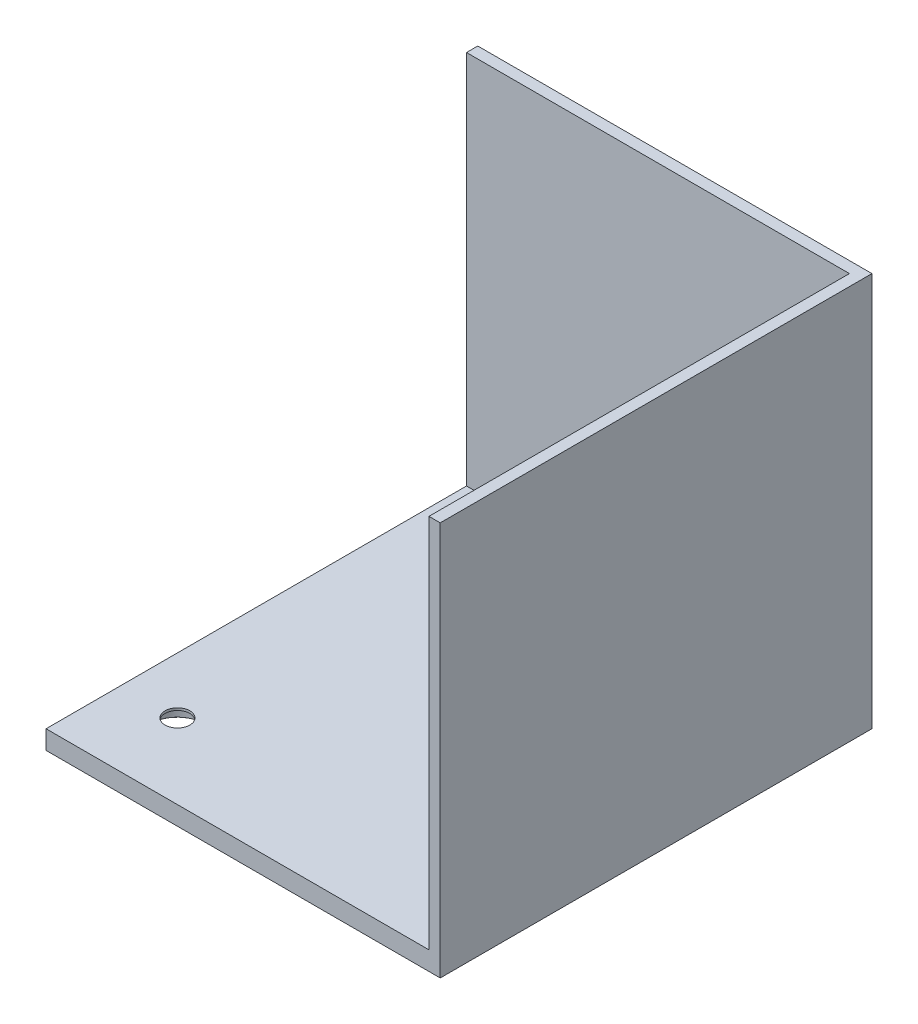
ISO-10303-21;
HEADER;
FILE_DESCRIPTION(('STEP AP214'),'2;1');
FILE_NAME('part.step','',(''),(''),'','','');
FILE_SCHEMA(('AUTOMOTIVE_DESIGN { 1 0 10303 214 1 1 1 1 }'));
ENDSEC;
DATA;
#1=APPLICATION_CONTEXT('core data for automotive mechanical design processes');
#2=APPLICATION_PROTOCOL_DEFINITION('international standard','automotive_design',2000,#1);
#3=PRODUCT_CONTEXT('',#1,'mechanical');
#4=PRODUCT('Part','Part','',(#3));
#5=PRODUCT_RELATED_PRODUCT_CATEGORY('part','',(#4));
#6=PRODUCT_DEFINITION_FORMATION('','',#4);
#7=PRODUCT_DEFINITION_CONTEXT('part definition',#1,'design');
#8=PRODUCT_DEFINITION('design','',#6,#7);
#9=PRODUCT_DEFINITION_SHAPE('','',#8);
#10=(LENGTH_UNIT() NAMED_UNIT(*) SI_UNIT(.MILLI.,.METRE.));
#11=(NAMED_UNIT(*) PLANE_ANGLE_UNIT() SI_UNIT($,.RADIAN.));
#12=(NAMED_UNIT(*) SI_UNIT($,.STERADIAN.) SOLID_ANGLE_UNIT());
#13=UNCERTAINTY_MEASURE_WITH_UNIT(LENGTH_MEASURE(1.E-05),#10,'distance_accuracy_value','');
#14=(GEOMETRIC_REPRESENTATION_CONTEXT(3) GLOBAL_UNCERTAINTY_ASSIGNED_CONTEXT((#13)) GLOBAL_UNIT_ASSIGNED_CONTEXT((#10,
#11,#12)) REPRESENTATION_CONTEXT('',''));
#15=CARTESIAN_POINT('',(0.,0.,0.));
#16=DIRECTION('',(0.,0.,1.));
#17=DIRECTION('',(1.,0.,0.));
#18=AXIS2_PLACEMENT_3D('',#15,#16,#17);
#19=CARTESIAN_POINT('',(52.5,105.,57.5));
#20=DIRECTION('',(-1.,0.,0.));
#21=DIRECTION('',(0.,0.,1.));
#22=AXIS2_PLACEMENT_3D('',#19,#20,#21);
#23=PLANE('',#22);
#24=DIRECTION('',(0.,0.,-1.));
#25=VECTOR('',#24,1.);
#26=CARTESIAN_POINT('',(52.5,0.,57.5));
#27=LINE('',#26,#25);
#28=CARTESIAN_POINT('',(52.5,0.,57.5));
#29=VERTEX_POINT('',#28);
#30=CARTESIAN_POINT('',(52.5,0.,-57.5));
#31=VERTEX_POINT('',#30);
#32=EDGE_CURVE('E137',#29,#31,#27,.T.);
#33=ORIENTED_EDGE('',*,*,#32,.T.);
#34=DIRECTION('',(0.,-1.,0.));
#35=VECTOR('',#34,1.);
#36=CARTESIAN_POINT('',(52.5,105.,-57.5));
#37=LINE('',#36,#35);
#38=CARTESIAN_POINT('',(52.5,105.,-57.5));
#39=VERTEX_POINT('',#38);
#40=EDGE_CURVE('E11',#39,#31,#37,.T.);
#41=ORIENTED_EDGE('',*,*,#40,.F.);
#42=DIRECTION('',(0.,0.,-1.));
#43=VECTOR('',#42,1.);
#44=CARTESIAN_POINT('',(52.5,105.,57.5));
#45=LINE('',#44,#43);
#46=CARTESIAN_POINT('',(52.5,105.,57.5));
#47=VERTEX_POINT('',#46);
#48=EDGE_CURVE('E139',#47,#39,#45,.T.);
#49=ORIENTED_EDGE('',*,*,#48,.F.);
#50=DIRECTION('',(0.,-1.,0.));
#51=VECTOR('',#50,1.);
#52=CARTESIAN_POINT('',(52.5,105.,57.5));
#53=LINE('',#52,#51);
#54=EDGE_CURVE('E146',#47,#29,#53,.T.);
#55=ORIENTED_EDGE('',*,*,#54,.T.);
#56=EDGE_LOOP('',(#33,#41,#49,#55));
#57=FACE_BOUND('',#56,.T.);
#58=ADVANCED_FACE('F37',(#57),#23,.F.);
#59=CARTESIAN_POINT('',(-52.5,105.,-57.5));
#60=DIRECTION('',(0.,0.,1.));
#61=DIRECTION('',(1.,0.,0.));
#62=AXIS2_PLACEMENT_3D('',#59,#60,#61);
#63=PLANE('',#62);
#64=DIRECTION('',(-1.,0.,0.));
#65=VECTOR('',#64,1.);
#66=CARTESIAN_POINT('',(-52.5,0.,-57.5));
#67=LINE('',#66,#65);
#68=CARTESIAN_POINT('',(-52.5,0.,-57.5));
#69=VERTEX_POINT('',#68);
#70=EDGE_CURVE('E149',#31,#69,#67,.T.);
#71=ORIENTED_EDGE('',*,*,#70,.T.);
#72=DIRECTION('',(0.,-1.,0.));
#73=VECTOR('',#72,1.);
#74=CARTESIAN_POINT('',(-52.5,105.,-57.5));
#75=LINE('',#74,#73);
#76=CARTESIAN_POINT('',(-52.5,105.,-57.5));
#77=VERTEX_POINT('',#76);
#78=EDGE_CURVE('E45',#77,#69,#75,.T.);
#79=ORIENTED_EDGE('',*,*,#78,.F.);
#80=DIRECTION('',(-1.,0.,0.));
#81=VECTOR('',#80,1.);
#82=CARTESIAN_POINT('',(-52.5,105.,-57.5));
#83=LINE('',#82,#81);
#84=EDGE_CURVE('E86',#39,#77,#83,.T.);
#85=ORIENTED_EDGE('',*,*,#84,.F.);
#86=ORIENTED_EDGE('',*,*,#40,.T.);
#87=EDGE_LOOP('',(#71,#79,#85,#86));
#88=FACE_BOUND('',#87,.T.);
#89=ADVANCED_FACE('F219',(#88),#63,.F.);
#90=CARTESIAN_POINT('',(-52.5,105.,57.5));
#91=DIRECTION('',(1.,0.,0.));
#92=DIRECTION('',(0.,0.,-1.));
#93=AXIS2_PLACEMENT_3D('',#90,#91,#92);
#94=PLANE('',#93);
#95=DIRECTION('',(0.,0.,1.));
#96=VECTOR('',#95,1.);
#97=CARTESIAN_POINT('',(-52.5,4.99999999999999,-54.5));
#98=LINE('',#97,#96);
#99=CARTESIAN_POINT('',(-52.5,4.99999999999999,-54.5));
#100=VERTEX_POINT('',#99);
#101=CARTESIAN_POINT('',(-52.5,4.99999999999999,57.5));
#102=VERTEX_POINT('',#101);
#103=EDGE_CURVE('E119',#100,#102,#98,.T.);
#104=ORIENTED_EDGE('',*,*,#103,.F.);
#105=DIRECTION('',(0.,1.,0.));
#106=VECTOR('',#105,1.);
#107=CARTESIAN_POINT('',(-52.5,4.99999999999999,-54.5));
#108=LINE('',#107,#106);
#109=CARTESIAN_POINT('',(-52.5,105.,-54.5));
#110=VERTEX_POINT('',#109);
#111=EDGE_CURVE('E110',#100,#110,#108,.T.);
#112=ORIENTED_EDGE('',*,*,#111,.T.);
#113=DIRECTION('',(0.,0.,1.));
#114=VECTOR('',#113,1.);
#115=CARTESIAN_POINT('',(-52.5,105.,57.5));
#116=LINE('',#115,#114);
#117=EDGE_CURVE('E142',#77,#110,#116,.T.);
#118=ORIENTED_EDGE('',*,*,#117,.F.);
#119=ORIENTED_EDGE('',*,*,#78,.T.);
#120=DIRECTION('',(0.,0.,1.));
#121=VECTOR('',#120,1.);
#122=CARTESIAN_POINT('',(-52.5,0.,57.5));
#123=LINE('',#122,#121);
#124=CARTESIAN_POINT('',(-52.5,0.,57.5));
#125=VERTEX_POINT('',#124);
#126=EDGE_CURVE('E151',#69,#125,#123,.T.);
#127=ORIENTED_EDGE('',*,*,#126,.T.);
#128=DIRECTION('',(0.,-1.,0.));
#129=VECTOR('',#128,1.);
#130=CARTESIAN_POINT('',(-52.5,105.,57.5));
#131=LINE('',#130,#129);
#132=EDGE_CURVE('E156',#102,#125,#131,.T.);
#133=ORIENTED_EDGE('',*,*,#132,.F.);
#134=EDGE_LOOP('',(#104,#112,#118,#119,#127,#133));
#135=FACE_BOUND('',#134,.T.);
#136=ADVANCED_FACE('F224',(#135),#94,.F.);
#137=CARTESIAN_POINT('',(-52.5,105.,57.5));
#138=DIRECTION('',(0.,0.,-1.));
#139=DIRECTION('',(-1.,0.,0.));
#140=AXIS2_PLACEMENT_3D('',#137,#138,#139);
#141=PLANE('',#140);
#142=DIRECTION('',(1.,0.,0.));
#143=VECTOR('',#142,1.);
#144=CARTESIAN_POINT('',(-52.5,105.,57.5));
#145=LINE('',#144,#143);
#146=CARTESIAN_POINT('',(49.5,105.,57.5));
#147=VERTEX_POINT('',#146);
#148=EDGE_CURVE('E61',#147,#47,#145,.T.);
#149=ORIENTED_EDGE('',*,*,#148,.F.);
#150=DIRECTION('',(0.,1.,0.));
#151=VECTOR('',#150,1.);
#152=CARTESIAN_POINT('',(49.5,4.99999999999999,57.5));
#153=LINE('',#152,#151);
#154=CARTESIAN_POINT('',(49.5,4.99999999999999,57.5));
#155=VERTEX_POINT('',#154);
#156=EDGE_CURVE('E135',#155,#147,#153,.T.);
#157=ORIENTED_EDGE('',*,*,#156,.F.);
#158=DIRECTION('',(1.,0.,0.));
#159=VECTOR('',#158,1.);
#160=CARTESIAN_POINT('',(49.5,4.99999999999999,57.5));
#161=LINE('',#160,#159);
#162=EDGE_CURVE('E111',#102,#155,#161,.T.);
#163=ORIENTED_EDGE('',*,*,#162,.F.);
#164=ORIENTED_EDGE('',*,*,#132,.T.);
#165=DIRECTION('',(1.,0.,0.));
#166=VECTOR('',#165,1.);
#167=CARTESIAN_POINT('',(-52.5,0.,57.5));
#168=LINE('',#167,#166);
#169=EDGE_CURVE('E81',#125,#29,#168,.T.);
#170=ORIENTED_EDGE('',*,*,#169,.T.);
#171=ORIENTED_EDGE('',*,*,#54,.F.);
#172=EDGE_LOOP('',(#149,#157,#163,#164,#170,#171));
#173=FACE_BOUND('',#172,.T.);
#174=ADVANCED_FACE('F235',(#173),#141,.F.);
#175=CARTESIAN_POINT('',(0.,105.,0.));
#176=DIRECTION('',(0.,-1.,0.));
#177=DIRECTION('',(0.,0.,-1.));
#178=AXIS2_PLACEMENT_3D('',#175,#176,#177);
#179=PLANE('',#178);
#180=DIRECTION('',(-1.,0.,0.));
#181=VECTOR('',#180,1.);
#182=CARTESIAN_POINT('',(49.5,105.,-54.5));
#183=LINE('',#182,#181);
#184=CARTESIAN_POINT('',(49.5,105.,-54.5));
#185=VERTEX_POINT('',#184);
#186=EDGE_CURVE('E124',#185,#110,#183,.T.);
#187=ORIENTED_EDGE('',*,*,#186,.F.);
#188=DIRECTION('',(0.,0.,-1.));
#189=VECTOR('',#188,1.);
#190=CARTESIAN_POINT('',(49.5,105.,-54.5));
#191=LINE('',#190,#189);
#192=EDGE_CURVE('E53',#147,#185,#191,.T.);
#193=ORIENTED_EDGE('',*,*,#192,.F.);
#194=ORIENTED_EDGE('',*,*,#148,.T.);
#195=ORIENTED_EDGE('',*,*,#48,.T.);
#196=ORIENTED_EDGE('',*,*,#84,.T.);
#197=ORIENTED_EDGE('',*,*,#117,.T.);
#198=EDGE_LOOP('',(#187,#193,#194,#195,#196,#197));
#199=FACE_BOUND('',#198,.T.);
#200=ADVANCED_FACE('F234',(#199),#179,.F.);
#201=CARTESIAN_POINT('',(0.,0.,0.));
#202=DIRECTION('',(0.,-1.,0.));
#203=DIRECTION('',(0.,0.,-1.));
#204=AXIS2_PLACEMENT_3D('',#201,#202,#203);
#205=PLANE('',#204);
#206=CARTESIAN_POINT('',(37.5,0.,37.5));
#207=DIRECTION('',(0.,-1.,0.));
#208=DIRECTION('',(0.,0.,-1.));
#209=AXIS2_PLACEMENT_3D('',#206,#207,#208);
#210=CIRCLE('',#209,7.3);
#211=CARTESIAN_POINT('',(37.5,0.,30.2));
#212=VERTEX_POINT('',#211);
#213=EDGE_CURVE('E323',#212,#212,#210,.T.);
#214=ORIENTED_EDGE('',*,*,#213,.F.);
#215=EDGE_LOOP('',(#214));
#216=FACE_BOUND('',#215,.T.);
#217=CARTESIAN_POINT('',(37.5,0.,-37.5));
#218=DIRECTION('',(0.,-1.,0.));
#219=DIRECTION('',(0.,0.,-1.));
#220=AXIS2_PLACEMENT_3D('',#217,#218,#219);
#221=CIRCLE('',#220,7.3);
#222=CARTESIAN_POINT('',(37.5,0.,-44.8));
#223=VERTEX_POINT('',#222);
#224=EDGE_CURVE('E333',#223,#223,#221,.T.);
#225=ORIENTED_EDGE('',*,*,#224,.F.);
#226=EDGE_LOOP('',(#225));
#227=FACE_BOUND('',#226,.T.);
#228=CARTESIAN_POINT('',(-37.5,0.,-37.5));
#229=DIRECTION('',(0.,-1.,0.));
#230=DIRECTION('',(0.,0.,-1.));
#231=AXIS2_PLACEMENT_3D('',#228,#229,#230);
#232=CIRCLE('',#231,7.3);
#233=CARTESIAN_POINT('',(-37.5,0.,-44.8));
#234=VERTEX_POINT('',#233);
#235=EDGE_CURVE('E168',#234,#234,#232,.T.);
#236=ORIENTED_EDGE('',*,*,#235,.F.);
#237=EDGE_LOOP('',(#236));
#238=FACE_BOUND('',#237,.T.);
#239=CARTESIAN_POINT('',(-37.5,0.,37.5));
#240=DIRECTION('',(0.,-1.,0.));
#241=DIRECTION('',(0.,0.,-1.));
#242=AXIS2_PLACEMENT_3D('',#239,#240,#241);
#243=CIRCLE('',#242,7.3);
#244=CARTESIAN_POINT('',(-37.5,0.,30.2));
#245=VERTEX_POINT('',#244);
#246=EDGE_CURVE('E164',#245,#245,#243,.T.);
#247=ORIENTED_EDGE('',*,*,#246,.F.);
#248=EDGE_LOOP('',(#247));
#249=FACE_BOUND('',#248,.T.);
#250=ORIENTED_EDGE('',*,*,#32,.F.);
#251=ORIENTED_EDGE('',*,*,#169,.F.);
#252=ORIENTED_EDGE('',*,*,#126,.F.);
#253=ORIENTED_EDGE('',*,*,#70,.F.);
#254=EDGE_LOOP('',(#250,#251,#252,#253));
#255=FACE_BOUND('',#254,.T.);
#256=ADVANCED_FACE('F229',(#216,#227,#238,#249,#255),#205,.T.);
#257=CARTESIAN_POINT('',(49.5,4.99999999999999,-54.5));
#258=DIRECTION('',(1.,0.,0.));
#259=DIRECTION('',(0.,0.,-1.));
#260=AXIS2_PLACEMENT_3D('',#257,#258,#259);
#261=PLANE('',#260);
#262=ORIENTED_EDGE('',*,*,#192,.T.);
#263=DIRECTION('',(0.,1.,0.));
#264=VECTOR('',#263,1.);
#265=CARTESIAN_POINT('',(49.5,4.99999999999999,-54.5));
#266=LINE('',#265,#264);
#267=CARTESIAN_POINT('',(49.5,4.99999999999999,-54.5));
#268=VERTEX_POINT('',#267);
#269=EDGE_CURVE('E102',#268,#185,#266,.T.);
#270=ORIENTED_EDGE('',*,*,#269,.F.);
#271=DIRECTION('',(0.,0.,-1.));
#272=VECTOR('',#271,1.);
#273=CARTESIAN_POINT('',(49.5,4.99999999999999,-54.5));
#274=LINE('',#273,#272);
#275=EDGE_CURVE('E106',#155,#268,#274,.T.);
#276=ORIENTED_EDGE('',*,*,#275,.F.);
#277=ORIENTED_EDGE('',*,*,#156,.T.);
#278=EDGE_LOOP('',(#262,#270,#276,#277));
#279=FACE_BOUND('',#278,.T.);
#280=ADVANCED_FACE('F104',(#279),#261,.F.);
#281=CARTESIAN_POINT('',(49.5,4.99999999999999,-54.5));
#282=DIRECTION('',(0.,0.,-1.));
#283=DIRECTION('',(-1.,0.,0.));
#284=AXIS2_PLACEMENT_3D('',#281,#282,#283);
#285=PLANE('',#284);
#286=ORIENTED_EDGE('',*,*,#186,.T.);
#287=ORIENTED_EDGE('',*,*,#111,.F.);
#288=DIRECTION('',(-1.,0.,0.));
#289=VECTOR('',#288,1.);
#290=CARTESIAN_POINT('',(49.5,4.99999999999999,-54.5));
#291=LINE('',#290,#289);
#292=EDGE_CURVE('E114',#268,#100,#291,.T.);
#293=ORIENTED_EDGE('',*,*,#292,.F.);
#294=ORIENTED_EDGE('',*,*,#269,.T.);
#295=EDGE_LOOP('',(#286,#287,#293,#294));
#296=FACE_BOUND('',#295,.T.);
#297=ADVANCED_FACE('F115',(#296),#285,.F.);
#298=CARTESIAN_POINT('',(0.,4.99999999999999,0.));
#299=DIRECTION('',(0.,-1.,0.));
#300=DIRECTION('',(0.,0.,-1.));
#301=AXIS2_PLACEMENT_3D('',#298,#299,#300);
#302=PLANE('',#301);
#303=CARTESIAN_POINT('',(37.5,4.99999999999999,37.5));
#304=DIRECTION('',(0.,-1.,0.));
#305=DIRECTION('',(0.,0.,-1.));
#306=AXIS2_PLACEMENT_3D('',#303,#304,#305);
#307=CIRCLE('',#306,3.29999999999999);
#308=CARTESIAN_POINT('',(37.5,4.99999999999999,34.2));
#309=VERTEX_POINT('',#308);
#310=EDGE_CURVE('E40',#309,#309,#307,.T.);
#311=ORIENTED_EDGE('',*,*,#310,.T.);
#312=EDGE_LOOP('',(#311));
#313=FACE_BOUND('',#312,.T.);
#314=CARTESIAN_POINT('',(37.5,4.99999999999999,-37.5));
#315=DIRECTION('',(0.,-1.,0.));
#316=DIRECTION('',(0.,0.,-1.));
#317=AXIS2_PLACEMENT_3D('',#314,#315,#316);
#318=CIRCLE('',#317,3.29999999999999);
#319=CARTESIAN_POINT('',(37.5,4.99999999999999,-40.8));
#320=VERTEX_POINT('',#319);
#321=EDGE_CURVE('E166',#320,#320,#318,.T.);
#322=ORIENTED_EDGE('',*,*,#321,.T.);
#323=EDGE_LOOP('',(#322));
#324=FACE_BOUND('',#323,.T.);
#325=CARTESIAN_POINT('',(-37.5,4.99999999999999,-37.5));
#326=DIRECTION('',(0.,-1.,0.));
#327=DIRECTION('',(0.,0.,-1.));
#328=AXIS2_PLACEMENT_3D('',#325,#326,#327);
#329=CIRCLE('',#328,3.29999999999999);
#330=CARTESIAN_POINT('',(-37.5,4.99999999999999,-40.8));
#331=VERTEX_POINT('',#330);
#332=EDGE_CURVE('E162',#331,#331,#329,.T.);
#333=ORIENTED_EDGE('',*,*,#332,.T.);
#334=EDGE_LOOP('',(#333));
#335=FACE_BOUND('',#334,.T.);
#336=CARTESIAN_POINT('',(-37.5,4.99999999999999,37.5));
#337=DIRECTION('',(0.,-1.,0.));
#338=DIRECTION('',(0.,0.,-1.));
#339=AXIS2_PLACEMENT_3D('',#336,#337,#338);
#340=CIRCLE('',#339,3.29999999999999);
#341=CARTESIAN_POINT('',(-37.5,4.99999999999999,34.2));
#342=VERTEX_POINT('',#341);
#343=EDGE_CURVE('E133',#342,#342,#340,.T.);
#344=ORIENTED_EDGE('',*,*,#343,.T.);
#345=EDGE_LOOP('',(#344));
#346=FACE_BOUND('',#345,.T.);
#347=ORIENTED_EDGE('',*,*,#275,.T.);
#348=ORIENTED_EDGE('',*,*,#292,.T.);
#349=ORIENTED_EDGE('',*,*,#103,.T.);
#350=ORIENTED_EDGE('',*,*,#162,.T.);
#351=EDGE_LOOP('',(#347,#348,#349,#350));
#352=FACE_BOUND('',#351,.T.);
#353=ADVANCED_FACE('F121',(#313,#324,#335,#346,#352),#302,.F.);
#354=CARTESIAN_POINT('',(-37.5,0.,37.5));
#355=DIRECTION('',(0.,-1.,0.));
#356=DIRECTION('',(0.,0.,-1.));
#357=AXIS2_PLACEMENT_3D('',#354,#355,#356);
#358=CYLINDRICAL_SURFACE('',#357,3.29999999999999);
#359=CARTESIAN_POINT('',(-37.5,4.38,37.5));
#360=DIRECTION('',(0.,-1.,0.));
#361=DIRECTION('',(0.,0.,-1.));
#362=AXIS2_PLACEMENT_3D('',#359,#360,#361);
#363=CIRCLE('',#362,3.3);
#364=CARTESIAN_POINT('',(-37.5,4.38,34.2));
#365=VERTEX_POINT('',#364);
#366=EDGE_CURVE('E128',#365,#365,#363,.T.);
#367=ORIENTED_EDGE('',*,*,#366,.T.);
#368=EDGE_LOOP('',(#367));
#369=FACE_BOUND('',#368,.T.);
#370=ORIENTED_EDGE('',*,*,#343,.F.);
#371=EDGE_LOOP('',(#370));
#372=FACE_BOUND('',#371,.T.);
#373=ADVANCED_FACE('F203',(#369,#372),#358,.F.);
#374=CARTESIAN_POINT('',(-30.225,4.38,37.5));
#375=DIRECTION('',(0.,1.,0.));
#376=DIRECTION('',(0.,0.,1.));
#377=AXIS2_PLACEMENT_3D('',#374,#375,#376);
#378=PLANE('',#377);
#379=ORIENTED_EDGE('',*,*,#366,.F.);
#380=EDGE_LOOP('',(#379));
#381=FACE_BOUND('',#380,.T.);
#382=CARTESIAN_POINT('',(-37.5,4.38,37.5));
#383=DIRECTION('',(0.,-1.,0.));
#384=DIRECTION('',(0.,0.,-1.));
#385=AXIS2_PLACEMENT_3D('',#382,#383,#384);
#386=CIRCLE('',#385,7.275);
#387=CARTESIAN_POINT('',(-37.5,4.38,30.225));
#388=VERTEX_POINT('',#387);
#389=EDGE_CURVE('E196',#388,#388,#386,.T.);
#390=ORIENTED_EDGE('',*,*,#389,.T.);
#391=EDGE_LOOP('',(#390));
#392=FACE_BOUND('',#391,.T.);
#393=ADVANCED_FACE('F206',(#381,#392),#378,.F.);
#394=CARTESIAN_POINT('',(-37.5,0.,37.5));
#395=DIRECTION('',(0.,-1.,0.));
#396=DIRECTION('',(0.,0.,-1.));
#397=AXIS2_PLACEMENT_3D('',#394,#395,#396);
#398=CYLINDRICAL_SURFACE('',#397,7.275);
#399=ORIENTED_EDGE('',*,*,#389,.F.);
#400=EDGE_LOOP('',(#399));
#401=FACE_BOUND('',#400,.T.);
#402=CARTESIAN_POINT('',(-37.5,0.024999999999999,37.5));
#403=DIRECTION('',(0.,-1.,0.));
#404=DIRECTION('',(0.,0.,-1.));
#405=AXIS2_PLACEMENT_3D('',#402,#403,#404);
#406=CIRCLE('',#405,7.275);
#407=CARTESIAN_POINT('',(-37.5,0.024999999999999,30.225));
#408=VERTEX_POINT('',#407);
#409=EDGE_CURVE('E194',#408,#408,#406,.T.);
#410=ORIENTED_EDGE('',*,*,#409,.T.);
#411=EDGE_LOOP('',(#410));
#412=FACE_BOUND('',#411,.T.);
#413=ADVANCED_FACE('F208',(#401,#412),#398,.F.);
#414=CARTESIAN_POINT('',(-37.5,0.,37.5));
#415=DIRECTION('',(0.,-1.,0.));
#416=DIRECTION('',(0.,0.,-1.));
#417=AXIS2_PLACEMENT_3D('',#414,#415,#416);
#418=CONICAL_SURFACE('',#417,7.3,0.785398163397466);
#419=ORIENTED_EDGE('',*,*,#409,.F.);
#420=EDGE_LOOP('',(#419));
#421=FACE_BOUND('',#420,.T.);
#422=ORIENTED_EDGE('',*,*,#246,.T.);
#423=EDGE_LOOP('',(#422));
#424=FACE_BOUND('',#423,.T.);
#425=ADVANCED_FACE('F214',(#421,#424),#418,.F.);
#426=CARTESIAN_POINT('',(-37.5,0.,-37.5));
#427=DIRECTION('',(0.,-1.,0.));
#428=DIRECTION('',(0.,0.,-1.));
#429=AXIS2_PLACEMENT_3D('',#426,#427,#428);
#430=CYLINDRICAL_SURFACE('',#429,3.29999999999999);
#431=CARTESIAN_POINT('',(-37.5,4.38,-37.5));
#432=DIRECTION('',(0.,-1.,0.));
#433=DIRECTION('',(0.,0.,-1.));
#434=AXIS2_PLACEMENT_3D('',#431,#432,#433);
#435=CIRCLE('',#434,3.3);
#436=CARTESIAN_POINT('',(-37.5,4.38,-40.8));
#437=VERTEX_POINT('',#436);
#438=EDGE_CURVE('E165',#437,#437,#435,.T.);
#439=ORIENTED_EDGE('',*,*,#438,.T.);
#440=EDGE_LOOP('',(#439));
#441=FACE_BOUND('',#440,.T.);
#442=ORIENTED_EDGE('',*,*,#332,.F.);
#443=EDGE_LOOP('',(#442));
#444=FACE_BOUND('',#443,.T.);
#445=ADVANCED_FACE('F263',(#441,#444),#430,.F.);
#446=CARTESIAN_POINT('',(-30.225,4.38,-37.5));
#447=DIRECTION('',(0.,1.,0.));
#448=DIRECTION('',(0.,0.,1.));
#449=AXIS2_PLACEMENT_3D('',#446,#447,#448);
#450=PLANE('',#449);
#451=ORIENTED_EDGE('',*,*,#438,.F.);
#452=EDGE_LOOP('',(#451));
#453=FACE_BOUND('',#452,.T.);
#454=CARTESIAN_POINT('',(-37.5,4.38,-37.5));
#455=DIRECTION('',(0.,-1.,0.));
#456=DIRECTION('',(0.,0.,-1.));
#457=AXIS2_PLACEMENT_3D('',#454,#455,#456);
#458=CIRCLE('',#457,7.275);
#459=CARTESIAN_POINT('',(-37.5,4.38,-44.775));
#460=VERTEX_POINT('',#459);
#461=EDGE_CURVE('E187',#460,#460,#458,.T.);
#462=ORIENTED_EDGE('',*,*,#461,.T.);
#463=EDGE_LOOP('',(#462));
#464=FACE_BOUND('',#463,.T.);
#465=ADVANCED_FACE('F265',(#453,#464),#450,.F.);
#466=CARTESIAN_POINT('',(-37.5,0.,-37.5));
#467=DIRECTION('',(0.,-1.,0.));
#468=DIRECTION('',(0.,0.,-1.));
#469=AXIS2_PLACEMENT_3D('',#466,#467,#468);
#470=CYLINDRICAL_SURFACE('',#469,7.275);
#471=ORIENTED_EDGE('',*,*,#461,.F.);
#472=EDGE_LOOP('',(#471));
#473=FACE_BOUND('',#472,.T.);
#474=CARTESIAN_POINT('',(-37.5,0.024999999999999,-37.5));
#475=DIRECTION('',(0.,-1.,0.));
#476=DIRECTION('',(0.,0.,-1.));
#477=AXIS2_PLACEMENT_3D('',#474,#475,#476);
#478=CIRCLE('',#477,7.275);
#479=CARTESIAN_POINT('',(-37.5,0.024999999999999,-44.775));
#480=VERTEX_POINT('',#479);
#481=EDGE_CURVE('E173',#480,#480,#478,.T.);
#482=ORIENTED_EDGE('',*,*,#481,.T.);
#483=EDGE_LOOP('',(#482));
#484=FACE_BOUND('',#483,.T.);
#485=ADVANCED_FACE('F272',(#473,#484),#470,.F.);
#486=CARTESIAN_POINT('',(-37.5,0.,-37.5));
#487=DIRECTION('',(0.,-1.,0.));
#488=DIRECTION('',(0.,0.,-1.));
#489=AXIS2_PLACEMENT_3D('',#486,#487,#488);
#490=CONICAL_SURFACE('',#489,7.3,0.785398163397466);
#491=ORIENTED_EDGE('',*,*,#481,.F.);
#492=EDGE_LOOP('',(#491));
#493=FACE_BOUND('',#492,.T.);
#494=ORIENTED_EDGE('',*,*,#235,.T.);
#495=EDGE_LOOP('',(#494));
#496=FACE_BOUND('',#495,.T.);
#497=ADVANCED_FACE('F280',(#493,#496),#490,.F.);
#498=CARTESIAN_POINT('',(37.5,0.,-37.5));
#499=DIRECTION('',(0.,-1.,0.));
#500=DIRECTION('',(0.,0.,-1.));
#501=AXIS2_PLACEMENT_3D('',#498,#499,#500);
#502=CYLINDRICAL_SURFACE('',#501,3.29999999999999);
#503=CARTESIAN_POINT('',(37.5,4.38,-37.5));
#504=DIRECTION('',(0.,-1.,0.));
#505=DIRECTION('',(0.,0.,-1.));
#506=AXIS2_PLACEMENT_3D('',#503,#504,#505);
#507=CIRCLE('',#506,3.3);
#508=CARTESIAN_POINT('',(37.5,4.38,-40.8));
#509=VERTEX_POINT('',#508);
#510=EDGE_CURVE('E169',#509,#509,#507,.T.);
#511=ORIENTED_EDGE('',*,*,#510,.T.);
#512=EDGE_LOOP('',(#511));
#513=FACE_BOUND('',#512,.T.);
#514=ORIENTED_EDGE('',*,*,#321,.F.);
#515=EDGE_LOOP('',(#514));
#516=FACE_BOUND('',#515,.T.);
#517=ADVANCED_FACE('F284',(#513,#516),#502,.F.);
#518=CARTESIAN_POINT('',(44.775,4.38,-37.5));
#519=DIRECTION('',(0.,1.,0.));
#520=DIRECTION('',(0.,0.,1.));
#521=AXIS2_PLACEMENT_3D('',#518,#519,#520);
#522=PLANE('',#521);
#523=ORIENTED_EDGE('',*,*,#510,.F.);
#524=EDGE_LOOP('',(#523));
#525=FACE_BOUND('',#524,.T.);
#526=CARTESIAN_POINT('',(37.5,4.38,-37.5));
#527=DIRECTION('',(0.,-1.,0.));
#528=DIRECTION('',(0.,0.,-1.));
#529=AXIS2_PLACEMENT_3D('',#526,#527,#528);
#530=CIRCLE('',#529,7.275);
#531=CARTESIAN_POINT('',(37.5,4.38,-44.775));
#532=VERTEX_POINT('',#531);
#533=EDGE_CURVE('E176',#532,#532,#530,.T.);
#534=ORIENTED_EDGE('',*,*,#533,.T.);
#535=EDGE_LOOP('',(#534));
#536=FACE_BOUND('',#535,.T.);
#537=ADVANCED_FACE('F288',(#525,#536),#522,.F.);
#538=CARTESIAN_POINT('',(37.5,0.,-37.5));
#539=DIRECTION('',(0.,-1.,0.));
#540=DIRECTION('',(0.,0.,-1.));
#541=AXIS2_PLACEMENT_3D('',#538,#539,#540);
#542=CYLINDRICAL_SURFACE('',#541,7.275);
#543=ORIENTED_EDGE('',*,*,#533,.F.);
#544=EDGE_LOOP('',(#543));
#545=FACE_BOUND('',#544,.T.);
#546=CARTESIAN_POINT('',(37.5,0.024999999999999,-37.5));
#547=DIRECTION('',(0.,-1.,0.));
#548=DIRECTION('',(0.,0.,-1.));
#549=AXIS2_PLACEMENT_3D('',#546,#547,#548);
#550=CIRCLE('',#549,7.275);
#551=CARTESIAN_POINT('',(37.5,0.024999999999999,-44.775));
#552=VERTEX_POINT('',#551);
#553=EDGE_CURVE('E181',#552,#552,#550,.T.);
#554=ORIENTED_EDGE('',*,*,#553,.T.);
#555=EDGE_LOOP('',(#554));
#556=FACE_BOUND('',#555,.T.);
#557=ADVANCED_FACE('F291',(#545,#556),#542,.F.);
#558=CARTESIAN_POINT('',(37.5,0.,-37.5));
#559=DIRECTION('',(0.,-1.,0.));
#560=DIRECTION('',(0.,0.,-1.));
#561=AXIS2_PLACEMENT_3D('',#558,#559,#560);
#562=CONICAL_SURFACE('',#561,7.3,0.785398163397396);
#563=ORIENTED_EDGE('',*,*,#553,.F.);
#564=EDGE_LOOP('',(#563));
#565=FACE_BOUND('',#564,.T.);
#566=ORIENTED_EDGE('',*,*,#224,.T.);
#567=EDGE_LOOP('',(#566));
#568=FACE_BOUND('',#567,.T.);
#569=ADVANCED_FACE('F295',(#565,#568),#562,.F.);
#570=CARTESIAN_POINT('',(37.5,0.,37.5));
#571=DIRECTION('',(0.,-1.,0.));
#572=DIRECTION('',(0.,0.,-1.));
#573=AXIS2_PLACEMENT_3D('',#570,#571,#572);
#574=CYLINDRICAL_SURFACE('',#573,3.29999999999999);
#575=CARTESIAN_POINT('',(37.5,4.38,37.5));
#576=DIRECTION('',(0.,-1.,0.));
#577=DIRECTION('',(0.,0.,-1.));
#578=AXIS2_PLACEMENT_3D('',#575,#576,#577);
#579=CIRCLE('',#578,3.3);
#580=CARTESIAN_POINT('',(37.5,4.38,34.2));
#581=VERTEX_POINT('',#580);
#582=EDGE_CURVE('E330',#581,#581,#579,.T.);
#583=ORIENTED_EDGE('',*,*,#582,.T.);
#584=EDGE_LOOP('',(#583));
#585=FACE_BOUND('',#584,.T.);
#586=ORIENTED_EDGE('',*,*,#310,.F.);
#587=EDGE_LOOP('',(#586));
#588=FACE_BOUND('',#587,.T.);
#589=ADVANCED_FACE('F299',(#585,#588),#574,.F.);
#590=CARTESIAN_POINT('',(44.775,4.38,37.5));
#591=DIRECTION('',(0.,1.,0.));
#592=DIRECTION('',(0.,0.,1.));
#593=AXIS2_PLACEMENT_3D('',#590,#591,#592);
#594=PLANE('',#593);
#595=ORIENTED_EDGE('',*,*,#582,.F.);
#596=EDGE_LOOP('',(#595));
#597=FACE_BOUND('',#596,.T.);
#598=CARTESIAN_POINT('',(37.5,4.38,37.5));
#599=DIRECTION('',(0.,-1.,0.));
#600=DIRECTION('',(0.,0.,-1.));
#601=AXIS2_PLACEMENT_3D('',#598,#599,#600);
#602=CIRCLE('',#601,7.275);
#603=CARTESIAN_POINT('',(37.5,4.38,30.225));
#604=VERTEX_POINT('',#603);
#605=EDGE_CURVE('E325',#604,#604,#602,.T.);
#606=ORIENTED_EDGE('',*,*,#605,.T.);
#607=EDGE_LOOP('',(#606));
#608=FACE_BOUND('',#607,.T.);
#609=ADVANCED_FACE('F303',(#597,#608),#594,.F.);
#610=CARTESIAN_POINT('',(37.5,0.,37.5));
#611=DIRECTION('',(0.,-1.,0.));
#612=DIRECTION('',(0.,0.,-1.));
#613=AXIS2_PLACEMENT_3D('',#610,#611,#612);
#614=CYLINDRICAL_SURFACE('',#613,7.275);
#615=ORIENTED_EDGE('',*,*,#605,.F.);
#616=EDGE_LOOP('',(#615));
#617=FACE_BOUND('',#616,.T.);
#618=CARTESIAN_POINT('',(37.5,0.024999999999999,37.5));
#619=DIRECTION('',(0.,-1.,0.));
#620=DIRECTION('',(0.,0.,-1.));
#621=AXIS2_PLACEMENT_3D('',#618,#619,#620);
#622=CIRCLE('',#621,7.275);
#623=CARTESIAN_POINT('',(37.5,0.024999999999999,30.225));
#624=VERTEX_POINT('',#623);
#625=EDGE_CURVE('E320',#624,#624,#622,.T.);
#626=ORIENTED_EDGE('',*,*,#625,.T.);
#627=EDGE_LOOP('',(#626));
#628=FACE_BOUND('',#627,.T.);
#629=ADVANCED_FACE('F307',(#617,#628),#614,.F.);
#630=CARTESIAN_POINT('',(37.5,0.,37.5));
#631=DIRECTION('',(0.,-1.,0.));
#632=DIRECTION('',(0.,0.,-1.));
#633=AXIS2_PLACEMENT_3D('',#630,#631,#632);
#634=CONICAL_SURFACE('',#633,7.3,0.785398163397396);
#635=ORIENTED_EDGE('',*,*,#625,.F.);
#636=EDGE_LOOP('',(#635));
#637=FACE_BOUND('',#636,.T.);
#638=ORIENTED_EDGE('',*,*,#213,.T.);
#639=EDGE_LOOP('',(#638));
#640=FACE_BOUND('',#639,.T.);
#641=ADVANCED_FACE('F311',(#637,#640),#634,.F.);
#642=CLOSED_SHELL('',(#58,#89,#136,#174,#200,#256,#280,#297,#353,#373,#393,#413,#425,#445,#465,
#485,#497,#517,#537,#557,#569,#589,#609,#629,#641));
#643=MANIFOLD_SOLID_BREP('B2',#642);
#644=ADVANCED_BREP_SHAPE_REPRESENTATION('',(#18,#643),#14);
#645=SHAPE_DEFINITION_REPRESENTATION(#9,#644);
ENDSEC;
END-ISO-10303-21;
